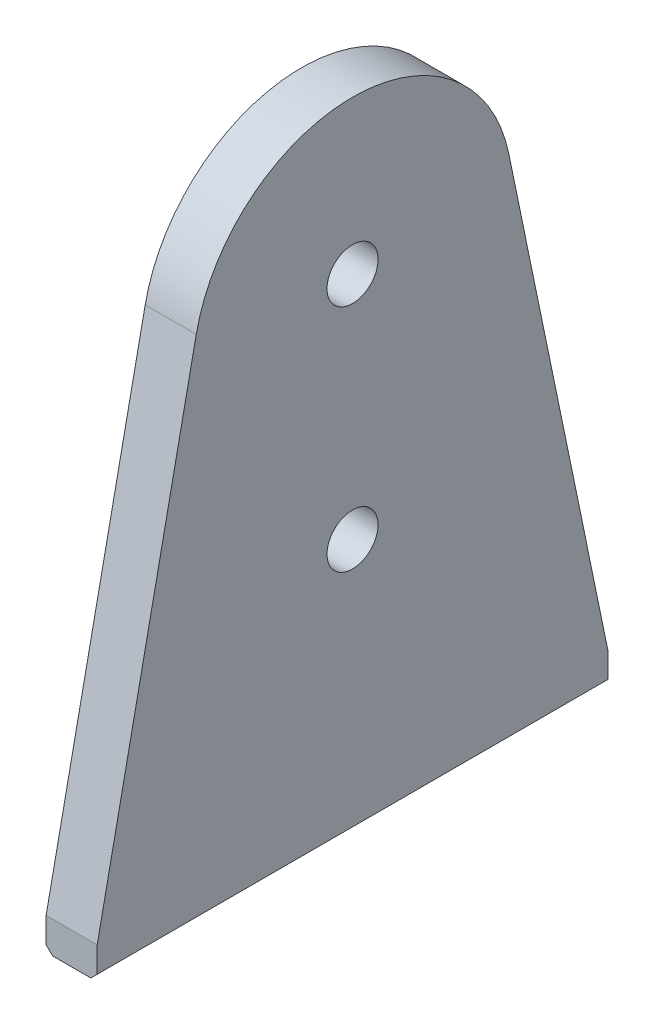
ISO-10303-21;
HEADER;
FILE_DESCRIPTION(('STEP AP214'),'2;1');
FILE_NAME('part.step','',(''),(''),'','','');
FILE_SCHEMA(('AUTOMOTIVE_DESIGN { 1 0 10303 214 1 1 1 1 }'));
ENDSEC;
DATA;
#1=APPLICATION_CONTEXT('core data for automotive mechanical design processes');
#2=APPLICATION_PROTOCOL_DEFINITION('international standard','automotive_design',2000,#1);
#3=PRODUCT_CONTEXT('',#1,'mechanical');
#4=PRODUCT('Part','Part','',(#3));
#5=PRODUCT_RELATED_PRODUCT_CATEGORY('part','',(#4));
#6=PRODUCT_DEFINITION_FORMATION('','',#4);
#7=PRODUCT_DEFINITION_CONTEXT('part definition',#1,'design');
#8=PRODUCT_DEFINITION('design','',#6,#7);
#9=PRODUCT_DEFINITION_SHAPE('','',#8);
#10=(LENGTH_UNIT() NAMED_UNIT(*) SI_UNIT(.MILLI.,.METRE.));
#11=(NAMED_UNIT(*) PLANE_ANGLE_UNIT() SI_UNIT($,.RADIAN.));
#12=(NAMED_UNIT(*) SI_UNIT($,.STERADIAN.) SOLID_ANGLE_UNIT());
#13=UNCERTAINTY_MEASURE_WITH_UNIT(LENGTH_MEASURE(1.E-05),#10,'distance_accuracy_value','');
#14=(GEOMETRIC_REPRESENTATION_CONTEXT(3) GLOBAL_UNCERTAINTY_ASSIGNED_CONTEXT((#13)) GLOBAL_UNIT_ASSIGNED_CONTEXT((#10,
#11,#12)) REPRESENTATION_CONTEXT('',''));
#15=CARTESIAN_POINT('',(0.,0.,0.));
#16=DIRECTION('',(0.,0.,1.));
#17=DIRECTION('',(1.,0.,0.));
#18=AXIS2_PLACEMENT_3D('',#15,#16,#17);
#19=CARTESIAN_POINT('',(8.,75.,0.));
#20=DIRECTION('',(1.,0.,0.));
#21=DIRECTION('',(0.,0.,-1.));
#22=AXIS2_PLACEMENT_3D('',#19,#20,#21);
#23=PLANE('',#22);
#24=CARTESIAN_POINT('',(8.,76.,0.));
#25=DIRECTION('',(1.,0.,0.));
#26=DIRECTION('',(0.,0.,-1.));
#27=AXIS2_PLACEMENT_3D('',#24,#25,#26);
#28=CIRCLE('',#27,4.);
#29=CARTESIAN_POINT('',(8.,76.,-4.));
#30=VERTEX_POINT('',#29);
#31=EDGE_CURVE('E215',#30,#30,#28,.T.);
#32=ORIENTED_EDGE('',*,*,#31,.F.);
#33=EDGE_LOOP('',(#32));
#34=FACE_BOUND('',#33,.T.);
#35=DIRECTION('',(0.,-1.,0.));
#36=VECTOR('',#35,1.);
#37=CARTESIAN_POINT('',(8.,0.,40.));
#38=LINE('',#37,#36);
#39=CARTESIAN_POINT('',(8.,4.99999999999999,40.));
#40=VERTEX_POINT('',#39);
#41=CARTESIAN_POINT('',(8.,0.999999999999987,40.));
#42=VERTEX_POINT('',#41);
#43=EDGE_CURVE('E169',#40,#42,#38,.T.);
#44=ORIENTED_EDGE('',*,*,#43,.T.);
#45=DIRECTION('',(0.,0.,-1.));
#46=VECTOR('',#45,1.);
#47=CARTESIAN_POINT('',(8.,0.999999999999987,-40.));
#48=LINE('',#47,#46);
#49=CARTESIAN_POINT('',(8.,0.999999999999987,-40.));
#50=VERTEX_POINT('',#49);
#51=EDGE_CURVE('E122',#42,#50,#48,.T.);
#52=ORIENTED_EDGE('',*,*,#51,.T.);
#53=DIRECTION('',(0.,1.,0.));
#54=VECTOR('',#53,1.);
#55=CARTESIAN_POINT('',(8.,0.,-40.));
#56=LINE('',#55,#54);
#57=CARTESIAN_POINT('',(8.,4.99999999999999,-40.));
#58=VERTEX_POINT('',#57);
#59=EDGE_CURVE('E115',#50,#58,#56,.T.);
#60=ORIENTED_EDGE('',*,*,#59,.T.);
#61=DIRECTION('',(0.,0.979292061671471,0.202452606669412));
#62=VECTOR('',#61,1.);
#63=CARTESIAN_POINT('',(8.,4.99999999999999,-40.));
#64=LINE('',#63,#62);
#65=CARTESIAN_POINT('',(8.,80.0613151667353,-24.4823015417868));
#66=VERTEX_POINT('',#65);
#67=EDGE_CURVE('E119',#58,#66,#64,.T.);
#68=ORIENTED_EDGE('',*,*,#67,.T.);
#69=CARTESIAN_POINT('',(8.,75.,0.));
#70=DIRECTION('',(1.,0.,0.));
#71=DIRECTION('',(0.,0.,-1.));
#72=AXIS2_PLACEMENT_3D('',#69,#70,#71);
#73=CIRCLE('',#72,25.);
#74=CARTESIAN_POINT('',(8.,80.0613151667353,24.4823015417868));
#75=VERTEX_POINT('',#74);
#76=EDGE_CURVE('E136',#66,#75,#73,.T.);
#77=ORIENTED_EDGE('',*,*,#76,.T.);
#78=DIRECTION('',(0.,-0.979292061671471,0.202452606669412));
#79=VECTOR('',#78,1.);
#80=CARTESIAN_POINT('',(8.,4.99999999999999,40.));
#81=LINE('',#80,#79);
#82=EDGE_CURVE('E174',#75,#40,#81,.T.);
#83=ORIENTED_EDGE('',*,*,#82,.T.);
#84=EDGE_LOOP('',(#44,#52,#60,#68,#77,#83));
#85=FACE_BOUND('',#84,.T.);
#86=CARTESIAN_POINT('',(8.,40.,0.));
#87=DIRECTION('',(1.,0.,0.));
#88=DIRECTION('',(0.,0.,-1.));
#89=AXIS2_PLACEMENT_3D('',#86,#87,#88);
#90=CIRCLE('',#89,4.00000000000001);
#91=CARTESIAN_POINT('',(8.,40.,-4.00000000000001));
#92=VERTEX_POINT('',#91);
#93=EDGE_CURVE('E225',#92,#92,#90,.T.);
#94=ORIENTED_EDGE('',*,*,#93,.F.);
#95=EDGE_LOOP('',(#94));
#96=FACE_BOUND('',#95,.T.);
#97=ADVANCED_FACE('F47',(#34,#85,#96),#23,.T.);
#98=CARTESIAN_POINT('',(0.,75.,0.));
#99=DIRECTION('',(1.,0.,0.));
#100=DIRECTION('',(0.,0.,-1.));
#101=AXIS2_PLACEMENT_3D('',#98,#99,#100);
#102=PLANE('',#101);
#103=DIRECTION('',(0.,1.,0.));
#104=VECTOR('',#103,1.);
#105=CARTESIAN_POINT('',(0.,0.,-40.));
#106=LINE('',#105,#104);
#107=CARTESIAN_POINT('',(0.,1.,-40.));
#108=VERTEX_POINT('',#107);
#109=CARTESIAN_POINT('',(0.,4.99999999999999,-40.));
#110=VERTEX_POINT('',#109);
#111=EDGE_CURVE('E139',#108,#110,#106,.T.);
#112=ORIENTED_EDGE('',*,*,#111,.F.);
#113=DIRECTION('',(0.,0.,1.));
#114=VECTOR('',#113,1.);
#115=CARTESIAN_POINT('',(0.,1.,0.));
#116=LINE('',#115,#114);
#117=CARTESIAN_POINT('',(0.,1.,40.));
#118=VERTEX_POINT('',#117);
#119=EDGE_CURVE('E11',#108,#118,#116,.T.);
#120=ORIENTED_EDGE('',*,*,#119,.T.);
#121=DIRECTION('',(0.,-1.,0.));
#122=VECTOR('',#121,1.);
#123=CARTESIAN_POINT('',(0.,0.,40.));
#124=LINE('',#123,#122);
#125=CARTESIAN_POINT('',(0.,4.99999999999999,40.));
#126=VERTEX_POINT('',#125);
#127=EDGE_CURVE('E126',#126,#118,#124,.T.);
#128=ORIENTED_EDGE('',*,*,#127,.F.);
#129=DIRECTION('',(0.,-0.979292061671471,0.202452606669412));
#130=VECTOR('',#129,1.);
#131=CARTESIAN_POINT('',(0.,4.99999999999999,40.));
#132=LINE('',#131,#130);
#133=CARTESIAN_POINT('',(0.,80.0613151667353,24.4823015417868));
#134=VERTEX_POINT('',#133);
#135=EDGE_CURVE('E200',#134,#126,#132,.T.);
#136=ORIENTED_EDGE('',*,*,#135,.F.);
#137=CARTESIAN_POINT('',(0.,75.,0.));
#138=DIRECTION('',(1.,0.,0.));
#139=DIRECTION('',(0.,0.,-1.));
#140=AXIS2_PLACEMENT_3D('',#137,#138,#139);
#141=CIRCLE('',#140,25.);
#142=CARTESIAN_POINT('',(0.,80.0613151667353,-24.4823015417868));
#143=VERTEX_POINT('',#142);
#144=EDGE_CURVE('E205',#143,#134,#141,.T.);
#145=ORIENTED_EDGE('',*,*,#144,.F.);
#146=DIRECTION('',(0.,0.979292061671471,0.202452606669412));
#147=VECTOR('',#146,1.);
#148=CARTESIAN_POINT('',(0.,4.99999999999999,-40.));
#149=LINE('',#148,#147);
#150=EDGE_CURVE('E209',#110,#143,#149,.T.);
#151=ORIENTED_EDGE('',*,*,#150,.F.);
#152=EDGE_LOOP('',(#112,#120,#128,#136,#145,#151));
#153=FACE_BOUND('',#152,.T.);
#154=CARTESIAN_POINT('',(0.,76.,0.));
#155=DIRECTION('',(1.,0.,0.));
#156=DIRECTION('',(0.,0.,-1.));
#157=AXIS2_PLACEMENT_3D('',#154,#155,#156);
#158=CIRCLE('',#157,4.);
#159=CARTESIAN_POINT('',(0.,76.,-4.));
#160=VERTEX_POINT('',#159);
#161=EDGE_CURVE('E221',#160,#160,#158,.T.);
#162=ORIENTED_EDGE('',*,*,#161,.T.);
#163=EDGE_LOOP('',(#162));
#164=FACE_BOUND('',#163,.T.);
#165=CARTESIAN_POINT('',(0.,40.,0.));
#166=DIRECTION('',(1.,0.,0.));
#167=DIRECTION('',(0.,0.,-1.));
#168=AXIS2_PLACEMENT_3D('',#165,#166,#167);
#169=CIRCLE('',#168,4.00000000000001);
#170=CARTESIAN_POINT('',(0.,40.,-4.00000000000001));
#171=VERTEX_POINT('',#170);
#172=EDGE_CURVE('E229',#171,#171,#169,.T.);
#173=ORIENTED_EDGE('',*,*,#172,.T.);
#174=EDGE_LOOP('',(#173));
#175=FACE_BOUND('',#174,.T.);
#176=ADVANCED_FACE('F203',(#153,#164,#175),#102,.F.);
#177=CARTESIAN_POINT('',(8.,0.,-40.));
#178=DIRECTION('',(0.,0.,1.));
#179=DIRECTION('',(1.,0.,0.));
#180=AXIS2_PLACEMENT_3D('',#177,#178,#179);
#181=PLANE('',#180);
#182=ORIENTED_EDGE('',*,*,#59,.F.);
#183=DIRECTION('',(-0.707106781186551,-0.707106781186544,0.));
#184=VECTOR('',#183,1.);
#185=CARTESIAN_POINT('',(8.,0.999999999999987,-40.));
#186=LINE('',#185,#184);
#187=CARTESIAN_POINT('',(7.,0.,-40.));
#188=VERTEX_POINT('',#187);
#189=EDGE_CURVE('E153',#50,#188,#186,.T.);
#190=ORIENTED_EDGE('',*,*,#189,.T.);
#191=DIRECTION('',(-1.,0.,0.));
#192=VECTOR('',#191,1.);
#193=CARTESIAN_POINT('',(8.,0.,-40.));
#194=LINE('',#193,#192);
#195=CARTESIAN_POINT('',(0.999999999999987,0.,-40.));
#196=VERTEX_POINT('',#195);
#197=EDGE_CURVE('E177',#188,#196,#194,.T.);
#198=ORIENTED_EDGE('',*,*,#197,.T.);
#199=DIRECTION('',(0.707106781186541,-0.707106781186554,0.));
#200=VECTOR('',#199,1.);
#201=CARTESIAN_POINT('',(0.999999999999987,0.,-40.));
#202=LINE('',#201,#200);
#203=EDGE_CURVE('E145',#196,#108,#202,.F.);
#204=ORIENTED_EDGE('',*,*,#203,.T.);
#205=ORIENTED_EDGE('',*,*,#111,.T.);
#206=DIRECTION('',(-1.,0.,0.));
#207=VECTOR('',#206,1.);
#208=CARTESIAN_POINT('',(8.,4.99999999999999,-40.));
#209=LINE('',#208,#207);
#210=EDGE_CURVE('E131',#58,#110,#209,.T.);
#211=ORIENTED_EDGE('',*,*,#210,.F.);
#212=EDGE_LOOP('',(#182,#190,#198,#204,#205,#211));
#213=FACE_BOUND('',#212,.T.);
#214=ADVANCED_FACE('F138',(#213),#181,.F.);
#215=CARTESIAN_POINT('',(8.,4.99999999999999,-40.));
#216=DIRECTION('',(0.,-0.202452606669412,0.979292061671471));
#217=DIRECTION('',(0.,-0.979292061671471,-0.202452606669412));
#218=AXIS2_PLACEMENT_3D('',#215,#216,#217);
#219=PLANE('',#218);
#220=ORIENTED_EDGE('',*,*,#150,.T.);
#221=DIRECTION('',(-1.,0.,0.));
#222=VECTOR('',#221,1.);
#223=CARTESIAN_POINT('',(8.,80.0613151667353,-24.4823015417868));
#224=LINE('',#223,#222);
#225=EDGE_CURVE('E133',#66,#143,#224,.T.);
#226=ORIENTED_EDGE('',*,*,#225,.F.);
#227=ORIENTED_EDGE('',*,*,#67,.F.);
#228=ORIENTED_EDGE('',*,*,#210,.T.);
#229=EDGE_LOOP('',(#220,#226,#227,#228));
#230=FACE_BOUND('',#229,.T.);
#231=ADVANCED_FACE('F130',(#230),#219,.F.);
#232=CARTESIAN_POINT('',(8.,75.,0.));
#233=DIRECTION('',(-1.,0.,0.));
#234=DIRECTION('',(0.,0.,1.));
#235=AXIS2_PLACEMENT_3D('',#232,#233,#234);
#236=CYLINDRICAL_SURFACE('',#235,25.);
#237=ORIENTED_EDGE('',*,*,#144,.T.);
#238=DIRECTION('',(-1.,0.,0.));
#239=VECTOR('',#238,1.);
#240=CARTESIAN_POINT('',(8.,80.0613151667353,24.4823015417868));
#241=LINE('',#240,#239);
#242=EDGE_CURVE('E147',#75,#134,#241,.T.);
#243=ORIENTED_EDGE('',*,*,#242,.F.);
#244=ORIENTED_EDGE('',*,*,#76,.F.);
#245=ORIENTED_EDGE('',*,*,#225,.T.);
#246=EDGE_LOOP('',(#237,#243,#244,#245));
#247=FACE_BOUND('',#246,.T.);
#248=ADVANCED_FACE('F258',(#247),#236,.T.);
#249=CARTESIAN_POINT('',(8.,4.99999999999999,40.));
#250=DIRECTION('',(0.,-0.202452606669412,-0.979292061671471));
#251=DIRECTION('',(0.,0.979292061671471,-0.202452606669412));
#252=AXIS2_PLACEMENT_3D('',#249,#250,#251);
#253=PLANE('',#252);
#254=ORIENTED_EDGE('',*,*,#135,.T.);
#255=DIRECTION('',(-1.,0.,0.));
#256=VECTOR('',#255,1.);
#257=CARTESIAN_POINT('',(8.,4.99999999999999,40.));
#258=LINE('',#257,#256);
#259=EDGE_CURVE('E188',#40,#126,#258,.T.);
#260=ORIENTED_EDGE('',*,*,#259,.F.);
#261=ORIENTED_EDGE('',*,*,#82,.F.);
#262=ORIENTED_EDGE('',*,*,#242,.T.);
#263=EDGE_LOOP('',(#254,#260,#261,#262));
#264=FACE_BOUND('',#263,.T.);
#265=ADVANCED_FACE('F199',(#264),#253,.F.);
#266=CARTESIAN_POINT('',(8.,0.,40.));
#267=DIRECTION('',(0.,0.,-1.));
#268=DIRECTION('',(-1.,0.,0.));
#269=AXIS2_PLACEMENT_3D('',#266,#267,#268);
#270=PLANE('',#269);
#271=DIRECTION('',(-1.,0.,0.));
#272=VECTOR('',#271,1.);
#273=CARTESIAN_POINT('',(8.,0.,40.));
#274=LINE('',#273,#272);
#275=CARTESIAN_POINT('',(7.,0.,40.));
#276=VERTEX_POINT('',#275);
#277=CARTESIAN_POINT('',(0.999999999999987,0.,40.));
#278=VERTEX_POINT('',#277);
#279=EDGE_CURVE('E170',#276,#278,#274,.T.);
#280=ORIENTED_EDGE('',*,*,#279,.F.);
#281=DIRECTION('',(0.707106781186551,0.707106781186544,0.));
#282=VECTOR('',#281,1.);
#283=CARTESIAN_POINT('',(8.,0.999999999999987,40.));
#284=LINE('',#283,#282);
#285=EDGE_CURVE('E57',#276,#42,#284,.T.);
#286=ORIENTED_EDGE('',*,*,#285,.T.);
#287=ORIENTED_EDGE('',*,*,#43,.F.);
#288=ORIENTED_EDGE('',*,*,#259,.T.);
#289=ORIENTED_EDGE('',*,*,#127,.T.);
#290=DIRECTION('',(-0.707106781186541,0.707106781186554,0.));
#291=VECTOR('',#290,1.);
#292=CARTESIAN_POINT('',(0.999999999999987,0.,40.));
#293=LINE('',#292,#291);
#294=EDGE_CURVE('E69',#118,#278,#293,.F.);
#295=ORIENTED_EDGE('',*,*,#294,.T.);
#296=EDGE_LOOP('',(#280,#286,#287,#288,#289,#295));
#297=FACE_BOUND('',#296,.T.);
#298=ADVANCED_FACE('F167',(#297),#270,.F.);
#299=CARTESIAN_POINT('',(8.,0.,-40.));
#300=DIRECTION('',(0.,1.,0.));
#301=DIRECTION('',(0.,0.,1.));
#302=AXIS2_PLACEMENT_3D('',#299,#300,#301);
#303=PLANE('',#302);
#304=ORIENTED_EDGE('',*,*,#197,.F.);
#305=DIRECTION('',(0.,0.,1.));
#306=VECTOR('',#305,1.);
#307=CARTESIAN_POINT('',(7.,0.,40.));
#308=LINE('',#307,#306);
#309=EDGE_CURVE('E160',#188,#276,#308,.T.);
#310=ORIENTED_EDGE('',*,*,#309,.T.);
#311=ORIENTED_EDGE('',*,*,#279,.T.);
#312=DIRECTION('',(0.,0.,-1.));
#313=VECTOR('',#312,1.);
#314=CARTESIAN_POINT('',(0.999999999999987,0.,-40.));
#315=LINE('',#314,#313);
#316=EDGE_CURVE('E156',#278,#196,#315,.T.);
#317=ORIENTED_EDGE('',*,*,#316,.T.);
#318=EDGE_LOOP('',(#304,#310,#311,#317));
#319=FACE_BOUND('',#318,.T.);
#320=ADVANCED_FACE('F183',(#319),#303,.F.);
#321=CARTESIAN_POINT('',(8.,76.,0.));
#322=DIRECTION('',(-1.,0.,0.));
#323=DIRECTION('',(0.,0.,1.));
#324=AXIS2_PLACEMENT_3D('',#321,#322,#323);
#325=CYLINDRICAL_SURFACE('',#324,4.);
#326=ORIENTED_EDGE('',*,*,#31,.T.);
#327=EDGE_LOOP('',(#326));
#328=FACE_BOUND('',#327,.T.);
#329=ORIENTED_EDGE('',*,*,#161,.F.);
#330=EDGE_LOOP('',(#329));
#331=FACE_BOUND('',#330,.T.);
#332=ADVANCED_FACE('F249',(#328,#331),#325,.F.);
#333=CARTESIAN_POINT('',(8.,40.,0.));
#334=DIRECTION('',(-1.,0.,0.));
#335=DIRECTION('',(0.,0.,1.));
#336=AXIS2_PLACEMENT_3D('',#333,#334,#335);
#337=CYLINDRICAL_SURFACE('',#336,4.00000000000001);
#338=ORIENTED_EDGE('',*,*,#93,.T.);
#339=EDGE_LOOP('',(#338));
#340=FACE_BOUND('',#339,.T.);
#341=ORIENTED_EDGE('',*,*,#172,.F.);
#342=EDGE_LOOP('',(#341));
#343=FACE_BOUND('',#342,.T.);
#344=ADVANCED_FACE('F237',(#340,#343),#337,.F.);
#345=CARTESIAN_POINT('',(8.,0.999999999999987,0.));
#346=DIRECTION('',(0.707106781186544,-0.707106781186551,0.));
#347=DIRECTION('',(0.,0.,1.));
#348=AXIS2_PLACEMENT_3D('',#345,#346,#347);
#349=PLANE('',#348);
#350=ORIENTED_EDGE('',*,*,#285,.F.);
#351=ORIENTED_EDGE('',*,*,#309,.F.);
#352=ORIENTED_EDGE('',*,*,#189,.F.);
#353=ORIENTED_EDGE('',*,*,#51,.F.);
#354=EDGE_LOOP('',(#350,#351,#352,#353));
#355=FACE_BOUND('',#354,.T.);
#356=ADVANCED_FACE('F179',(#355),#349,.T.);
#357=CARTESIAN_POINT('',(0.999999999999987,0.,-40.));
#358=DIRECTION('',(0.707106781186554,0.707106781186541,0.));
#359=DIRECTION('',(0.,0.,-1.));
#360=AXIS2_PLACEMENT_3D('',#357,#358,#359);
#361=PLANE('',#360);
#362=ORIENTED_EDGE('',*,*,#294,.F.);
#363=ORIENTED_EDGE('',*,*,#119,.F.);
#364=ORIENTED_EDGE('',*,*,#203,.F.);
#365=ORIENTED_EDGE('',*,*,#316,.F.);
#366=EDGE_LOOP('',(#362,#363,#364,#365));
#367=FACE_BOUND('',#366,.T.);
#368=ADVANCED_FACE('F50',(#367),#361,.F.);
#369=CLOSED_SHELL('',(#97,#176,#214,#231,#248,#265,#298,#320,#332,#344,#356,#368));
#370=MANIFOLD_SOLID_BREP('B2',#369);
#371=ADVANCED_BREP_SHAPE_REPRESENTATION('',(#18,#370),#14);
#372=SHAPE_DEFINITION_REPRESENTATION(#9,#371);
ENDSEC;
END-ISO-10303-21;
